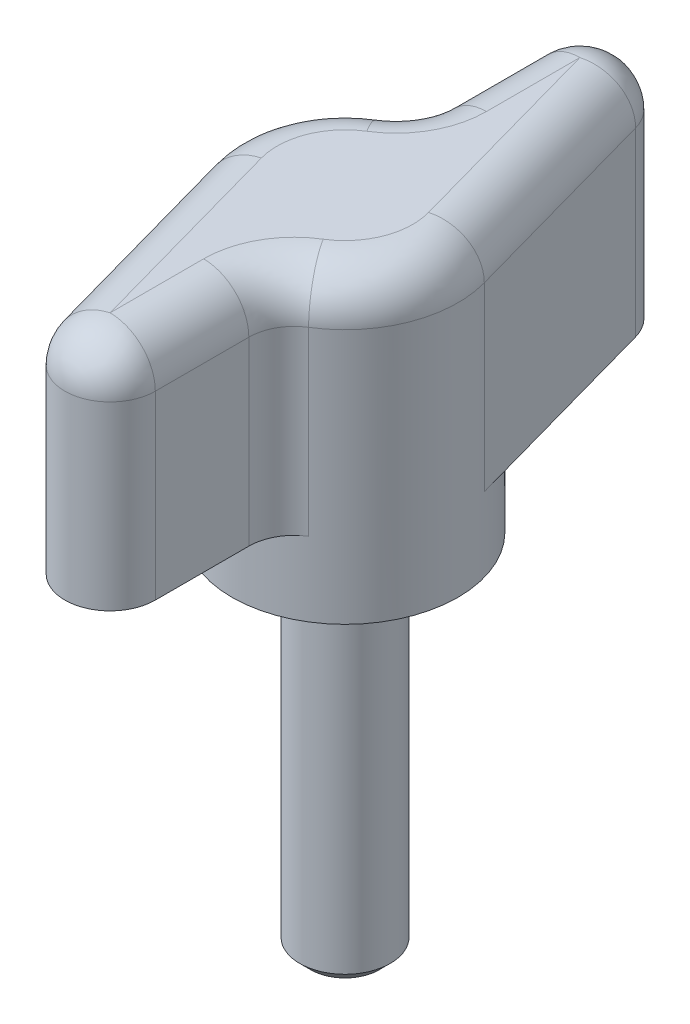
ISO-10303-21;
HEADER;
FILE_DESCRIPTION(('STEP AP214'),'2;1');
FILE_NAME('part.step','',(''),(''),'','','');
FILE_SCHEMA(('AUTOMOTIVE_DESIGN { 1 0 10303 214 1 1 1 1 }'));
ENDSEC;
DATA;
#1=APPLICATION_CONTEXT('core data for automotive mechanical design processes');
#2=APPLICATION_PROTOCOL_DEFINITION('international standard','automotive_design',2000,#1);
#3=PRODUCT_CONTEXT('',#1,'mechanical');
#4=PRODUCT('Part','Part','',(#3));
#5=PRODUCT_RELATED_PRODUCT_CATEGORY('part','',(#4));
#6=PRODUCT_DEFINITION_FORMATION('','',#4);
#7=PRODUCT_DEFINITION_CONTEXT('part definition',#1,'design');
#8=PRODUCT_DEFINITION('design','',#6,#7);
#9=PRODUCT_DEFINITION_SHAPE('','',#8);
#10=(LENGTH_UNIT() NAMED_UNIT(*) SI_UNIT(.MILLI.,.METRE.));
#11=(NAMED_UNIT(*) PLANE_ANGLE_UNIT() SI_UNIT($,.RADIAN.));
#12=(NAMED_UNIT(*) SI_UNIT($,.STERADIAN.) SOLID_ANGLE_UNIT());
#13=UNCERTAINTY_MEASURE_WITH_UNIT(LENGTH_MEASURE(1.E-05),#10,'distance_accuracy_value','');
#14=(GEOMETRIC_REPRESENTATION_CONTEXT(3) GLOBAL_UNCERTAINTY_ASSIGNED_CONTEXT((#13)) GLOBAL_UNIT_ASSIGNED_CONTEXT((#10,
#11,#12)) REPRESENTATION_CONTEXT('',''));
#15=CARTESIAN_POINT('',(0.,0.,0.));
#16=DIRECTION('',(0.,0.,1.));
#17=DIRECTION('',(1.,0.,0.));
#18=AXIS2_PLACEMENT_3D('',#15,#16,#17);
#19=CARTESIAN_POINT('',(0.,-25.4,0.));
#20=DIRECTION('',(0.,1.,0.));
#21=DIRECTION('',(0.,0.,1.));
#22=AXIS2_PLACEMENT_3D('',#19,#20,#21);
#23=CYLINDRICAL_SURFACE('',#22,3.175);
#24=CARTESIAN_POINT('',(0.,-24.638,0.));
#25=DIRECTION('',(0.,-1.,0.));
#26=DIRECTION('',(0.,0.,-1.));
#27=AXIS2_PLACEMENT_3D('',#24,#25,#26);
#28=CIRCLE('',#27,3.175);
#29=CARTESIAN_POINT('',(0.,-24.638,-3.175));
#30=VERTEX_POINT('',#29);
#31=EDGE_CURVE('E11',#30,#30,#28,.F.);
#32=ORIENTED_EDGE('',*,*,#31,.T.);
#33=EDGE_LOOP('',(#32));
#34=FACE_BOUND('',#33,.T.);
#35=CARTESIAN_POINT('',(0.,0.,0.));
#36=DIRECTION('',(0.,-1.,0.));
#37=DIRECTION('',(0.,0.,-1.));
#38=AXIS2_PLACEMENT_3D('',#35,#36,#37);
#39=CIRCLE('',#38,3.175);
#40=CARTESIAN_POINT('',(0.,0.,-3.175));
#41=VERTEX_POINT('',#40);
#42=EDGE_CURVE('E54',#41,#41,#39,.T.);
#43=ORIENTED_EDGE('',*,*,#42,.T.);
#44=EDGE_LOOP('',(#43));
#45=FACE_BOUND('',#44,.T.);
#46=ADVANCED_FACE('F43',(#34,#45),#23,.T.);
#47=CARTESIAN_POINT('',(0.,-25.4,0.));
#48=DIRECTION('',(0.,-1.,0.));
#49=DIRECTION('',(0.,0.,-1.));
#50=AXIS2_PLACEMENT_3D('',#47,#48,#49);
#51=PLANE('',#50);
#52=CARTESIAN_POINT('',(0.,-25.4,0.));
#53=DIRECTION('',(0.,-1.,0.));
#54=DIRECTION('',(0.,0.,-1.));
#55=AXIS2_PLACEMENT_3D('',#52,#53,#54);
#56=CIRCLE('',#55,2.413);
#57=CARTESIAN_POINT('',(0.,-25.4,-2.413));
#58=VERTEX_POINT('',#57);
#59=EDGE_CURVE('E50',#58,#58,#56,.T.);
#60=ORIENTED_EDGE('',*,*,#59,.T.);
#61=EDGE_LOOP('',(#60));
#62=FACE_BOUND('',#61,.T.);
#63=ADVANCED_FACE('F64',(#62),#51,.T.);
#64=CARTESIAN_POINT('',(0.,0.,0.));
#65=DIRECTION('',(0.,-1.,0.));
#66=DIRECTION('',(0.,0.,-1.));
#67=AXIS2_PLACEMENT_3D('',#64,#65,#66);
#68=PLANE('',#67);
#69=ORIENTED_EDGE('',*,*,#42,.F.);
#70=EDGE_LOOP('',(#69));
#71=FACE_BOUND('',#70,.T.);
#72=ADVANCED_FACE('F62',(#71),#68,.F.);
#73=CARTESIAN_POINT('',(0.,-25.4,0.));
#74=DIRECTION('',(0.,1.,0.));
#75=DIRECTION('',(0.,0.,1.));
#76=AXIS2_PLACEMENT_3D('',#73,#74,#75);
#77=CONICAL_SURFACE('',#76,2.413,0.785398163397447);
#78=ORIENTED_EDGE('',*,*,#31,.F.);
#79=EDGE_LOOP('',(#78));
#80=FACE_BOUND('',#79,.T.);
#81=ORIENTED_EDGE('',*,*,#59,.F.);
#82=EDGE_LOOP('',(#81));
#83=FACE_BOUND('',#82,.T.);
#84=ADVANCED_FACE('F45',(#80,#83),#77,.T.);
#85=CLOSED_SHELL('',(#46,#63,#72,#84));
#86=MANIFOLD_SOLID_BREP('B2',#85);
#87=CARTESIAN_POINT('',(0.,21.082,0.));
#88=DIRECTION('',(0.,-1.,0.));
#89=DIRECTION('',(0.,0.,-1.));
#90=AXIS2_PLACEMENT_3D('',#87,#88,#89);
#91=CYLINDRICAL_SURFACE('',#90,7.9375);
#92=CARTESIAN_POINT('',(0.,0.,0.));
#93=DIRECTION('',(0.,1.,0.));
#94=DIRECTION('',(0.,0.,1.));
#95=AXIS2_PLACEMENT_3D('',#92,#93,#94);
#96=CIRCLE('',#95,7.9375);
#97=CARTESIAN_POINT('',(0.,0.,7.9375));
#98=VERTEX_POINT('',#97);
#99=EDGE_CURVE('E247',#98,#98,#96,.T.);
#100=ORIENTED_EDGE('',*,*,#99,.T.);
#101=EDGE_LOOP('',(#100));
#102=FACE_BOUND('',#101,.T.);
#103=DIRECTION('',(0.,1.,0.));
#104=VECTOR('',#103,1.);
#105=CARTESIAN_POINT('',(7.64626830975385,5.207,-2.13037254611816));
#106=LINE('',#105,#104);
#107=CARTESIAN_POINT('',(7.64626830975385,5.207,-2.13037254611816));
#108=VERTEX_POINT('',#107);
#109=CARTESIAN_POINT('',(7.64626830975385,17.907,-2.13037254611816));
#110=VERTEX_POINT('',#109);
#111=EDGE_CURVE('E248',#108,#110,#106,.T.);
#112=ORIENTED_EDGE('',*,*,#111,.T.);
#113=CARTESIAN_POINT('',(0.,17.907,0.));
#114=DIRECTION('',(0.,1.,0.));
#115=DIRECTION('',(0.,0.,1.));
#116=AXIS2_PLACEMENT_3D('',#113,#114,#115);
#117=CIRCLE('',#116,7.9375);
#118=CARTESIAN_POINT('',(4.18894174287397,17.907,6.74215642986782));
#119=VERTEX_POINT('',#118);
#120=EDGE_CURVE('E291',#110,#119,#117,.F.);
#121=ORIENTED_EDGE('',*,*,#120,.T.);
#122=DIRECTION('',(0.,-1.,0.));
#123=VECTOR('',#122,1.);
#124=CARTESIAN_POINT('',(4.18894174287397,21.082,6.74215642986782));
#125=LINE('',#124,#123);
#126=CARTESIAN_POINT('',(4.18894174287397,5.207,6.74215642986782));
#127=VERTEX_POINT('',#126);
#128=EDGE_CURVE('E288',#119,#127,#125,.T.);
#129=ORIENTED_EDGE('',*,*,#128,.T.);
#130=CARTESIAN_POINT('',(0.,5.207,0.));
#131=DIRECTION('',(0.,-1.,0.));
#132=DIRECTION('',(0.,0.,-1.));
#133=AXIS2_PLACEMENT_3D('',#130,#131,#132);
#134=CIRCLE('',#133,7.9375);
#135=CARTESIAN_POINT('',(-7.64626830975387,5.207,2.13037254611811));
#136=VERTEX_POINT('',#135);
#137=EDGE_CURVE('E217',#127,#136,#134,.T.);
#138=ORIENTED_EDGE('',*,*,#137,.T.);
#139=DIRECTION('',(0.,1.,0.));
#140=VECTOR('',#139,1.);
#141=CARTESIAN_POINT('',(-7.64626830975387,5.207,2.13037254611811));
#142=LINE('',#141,#140);
#143=CARTESIAN_POINT('',(-7.64626830975387,17.907,2.13037254611811));
#144=VERTEX_POINT('',#143);
#145=EDGE_CURVE('E207',#136,#144,#142,.T.);
#146=ORIENTED_EDGE('',*,*,#145,.T.);
#147=CARTESIAN_POINT('',(0.,17.907,0.));
#148=DIRECTION('',(0.,1.,0.));
#149=DIRECTION('',(0.,0.,1.));
#150=AXIS2_PLACEMENT_3D('',#147,#148,#149);
#151=CIRCLE('',#150,7.9375);
#152=CARTESIAN_POINT('',(-4.18894174287402,17.907,-6.74215642986779));
#153=VERTEX_POINT('',#152);
#154=EDGE_CURVE('E286',#144,#153,#151,.F.);
#155=ORIENTED_EDGE('',*,*,#154,.T.);
#156=DIRECTION('',(0.,-1.,0.));
#157=VECTOR('',#156,1.);
#158=CARTESIAN_POINT('',(-4.18894174287402,21.082,-6.74215642986779));
#159=LINE('',#158,#157);
#160=CARTESIAN_POINT('',(-4.18894174287402,5.207,-6.74215642986779));
#161=VERTEX_POINT('',#160);
#162=EDGE_CURVE('E283',#153,#161,#159,.T.);
#163=ORIENTED_EDGE('',*,*,#162,.T.);
#164=CARTESIAN_POINT('',(0.,5.207,0.));
#165=DIRECTION('',(0.,-1.,0.));
#166=DIRECTION('',(0.,0.,1.));
#167=AXIS2_PLACEMENT_3D('',#164,#165,#166);
#168=CIRCLE('',#167,7.9375);
#169=EDGE_CURVE('E237',#161,#108,#168,.T.);
#170=ORIENTED_EDGE('',*,*,#169,.T.);
#171=EDGE_LOOP('',(#112,#121,#129,#138,#146,#155,#163,#170));
#172=FACE_BOUND('',#171,.T.);
#173=ADVANCED_FACE('F99',(#102,#172),#91,.T.);
#174=CARTESIAN_POINT('',(0.,21.082,0.));
#175=DIRECTION('',(0.,1.,0.));
#176=DIRECTION('',(0.,0.,1.));
#177=AXIS2_PLACEMENT_3D('',#174,#175,#176);
#178=PLANE('',#177);
#179=CARTESIAN_POINT('',(0.,21.082,0.));
#180=DIRECTION('',(0.,1.,0.));
#181=DIRECTION('',(0.,0.,1.));
#182=AXIS2_PLACEMENT_3D('',#179,#180,#181);
#183=CIRCLE('',#182,4.7625);
#184=CARTESIAN_POINT('',(2.51336504572438,21.082,4.04529385792069));
#185=VERTEX_POINT('',#184);
#186=CARTESIAN_POINT('',(4.58776098585231,21.082,-1.2782235276709));
#187=VERTEX_POINT('',#186);
#188=EDGE_CURVE('E270',#185,#187,#183,.T.);
#189=ORIENTED_EDGE('',*,*,#188,.T.);
#190=DIRECTION('',(-0.268393391636934,0.,-0.963309393354816));
#191=VECTOR('',#190,1.);
#192=CARTESIAN_POINT('',(4.58776098585231,21.082,-1.2782235276709));
#193=LINE('',#192,#191);
#194=CARTESIAN_POINT('',(0.485481559976375,21.082,-16.002));
#195=VERTEX_POINT('',#194);
#196=EDGE_CURVE('E272',#187,#195,#193,.T.);
#197=ORIENTED_EDGE('',*,*,#196,.T.);
#198=DIRECTION('',(0.,0.,1.));
#199=VECTOR('',#198,1.);
#200=CARTESIAN_POINT('',(0.485481559976374,21.082,0.));
#201=LINE('',#200,#199);
#202=CARTESIAN_POINT('',(0.485481559976374,21.082,-9.43901900181491));
#203=VERTEX_POINT('',#202);
#204=EDGE_CURVE('E264',#195,#203,#201,.T.);
#205=ORIENTED_EDGE('',*,*,#204,.T.);
#206=CARTESIAN_POINT('',(-5.86451844002362,21.082,-9.43901900181491));
#207=DIRECTION('',(0.,1.,0.));
#208=DIRECTION('',(0.,0.,1.));
#209=AXIS2_PLACEMENT_3D('',#206,#207,#208);
#210=CIRCLE('',#209,6.35);
#211=CARTESIAN_POINT('',(-2.51336504572441,21.082,-4.04529385792067));
#212=VERTEX_POINT('',#211);
#213=EDGE_CURVE('E261',#212,#203,#210,.T.);
#214=ORIENTED_EDGE('',*,*,#213,.F.);
#215=CARTESIAN_POINT('',(0.,21.082,0.));
#216=DIRECTION('',(0.,1.,0.));
#217=DIRECTION('',(0.,0.,1.));
#218=AXIS2_PLACEMENT_3D('',#215,#216,#217);
#219=CIRCLE('',#218,4.7625);
#220=CARTESIAN_POINT('',(-4.58776098585232,21.082,1.27822352767086));
#221=VERTEX_POINT('',#220);
#222=EDGE_CURVE('E255',#212,#221,#219,.T.);
#223=ORIENTED_EDGE('',*,*,#222,.T.);
#224=DIRECTION('',(0.268393391636927,0.,0.963309393354818));
#225=VECTOR('',#224,1.);
#226=CARTESIAN_POINT('',(-4.58776098585232,21.082,1.27822352767087));
#227=LINE('',#226,#225);
#228=CARTESIAN_POINT('',(-0.485481559976487,21.082,16.002));
#229=VERTEX_POINT('',#228);
#230=EDGE_CURVE('E257',#221,#229,#227,.T.);
#231=ORIENTED_EDGE('',*,*,#230,.T.);
#232=DIRECTION('',(0.,0.,-1.));
#233=VECTOR('',#232,1.);
#234=CARTESIAN_POINT('',(-0.485481559976374,21.082,0.));
#235=LINE('',#234,#233);
#236=CARTESIAN_POINT('',(-0.48548155997644,21.082,9.4390190018149));
#237=VERTEX_POINT('',#236);
#238=EDGE_CURVE('E259',#229,#237,#235,.T.);
#239=ORIENTED_EDGE('',*,*,#238,.T.);
#240=CARTESIAN_POINT('',(5.86451844002356,21.082,9.43901900181495));
#241=DIRECTION('',(0.,1.,0.));
#242=DIRECTION('',(0.,0.,1.));
#243=AXIS2_PLACEMENT_3D('',#240,#241,#242);
#244=CIRCLE('',#243,6.35);
#245=EDGE_CURVE('E267',#185,#237,#244,.T.);
#246=ORIENTED_EDGE('',*,*,#245,.F.);
#247=EDGE_LOOP('',(#189,#197,#205,#214,#223,#231,#239,#246));
#248=FACE_BOUND('',#247,.T.);
#249=ADVANCED_FACE('F350',(#248),#178,.T.);
#250=CARTESIAN_POINT('',(0.,0.,0.));
#251=DIRECTION('',(0.,1.,0.));
#252=DIRECTION('',(0.,0.,1.));
#253=AXIS2_PLACEMENT_3D('',#250,#251,#252);
#254=PLANE('',#253);
#255=ORIENTED_EDGE('',*,*,#99,.F.);
#256=EDGE_LOOP('',(#255));
#257=FACE_BOUND('',#256,.T.);
#258=ADVANCED_FACE('F389',(#257),#254,.F.);
#259=CARTESIAN_POINT('',(0.485481559976374,5.207,-16.002));
#260=DIRECTION('',(0.,1.,0.));
#261=DIRECTION('',(0.,0.,1.));
#262=AXIS2_PLACEMENT_3D('',#259,#260,#261);
#263=CYLINDRICAL_SURFACE('',#262,3.175);
#264=DIRECTION('',(0.,1.,0.));
#265=VECTOR('',#264,1.);
#266=CARTESIAN_POINT('',(-2.68951844002363,5.207,-16.002));
#267=LINE('',#266,#265);
#268=CARTESIAN_POINT('',(-2.68951844002363,5.207,-16.002));
#269=VERTEX_POINT('',#268);
#270=CARTESIAN_POINT('',(-2.68951844002363,17.907,-16.002));
#271=VERTEX_POINT('',#270);
#272=EDGE_CURVE('E243',#269,#271,#267,.T.);
#273=ORIENTED_EDGE('',*,*,#272,.T.);
#274=CARTESIAN_POINT('',(0.485481559976374,17.907,-16.002));
#275=DIRECTION('',(0.,1.,0.));
#276=DIRECTION('',(0.,0.,1.));
#277=AXIS2_PLACEMENT_3D('',#274,#275,#276);
#278=CIRCLE('',#277,3.175);
#279=CARTESIAN_POINT('',(3.54398888387792,17.907,-16.8541490184473));
#280=VERTEX_POINT('',#279);
#281=EDGE_CURVE('E279',#271,#280,#278,.F.);
#282=ORIENTED_EDGE('',*,*,#281,.T.);
#283=DIRECTION('',(0.,1.,0.));
#284=VECTOR('',#283,1.);
#285=CARTESIAN_POINT('',(3.54398888387792,5.207,-16.8541490184473));
#286=LINE('',#285,#284);
#287=CARTESIAN_POINT('',(3.54398888387792,5.207,-16.8541490184473));
#288=VERTEX_POINT('',#287);
#289=EDGE_CURVE('E244',#288,#280,#286,.T.);
#290=ORIENTED_EDGE('',*,*,#289,.F.);
#291=CARTESIAN_POINT('',(0.485481559976374,5.207,-16.002));
#292=DIRECTION('',(0.,1.,0.));
#293=DIRECTION('',(0.,0.,1.));
#294=AXIS2_PLACEMENT_3D('',#291,#292,#293);
#295=CIRCLE('',#294,3.175);
#296=EDGE_CURVE('E229',#288,#269,#295,.T.);
#297=ORIENTED_EDGE('',*,*,#296,.T.);
#298=EDGE_LOOP('',(#273,#282,#290,#297));
#299=FACE_BOUND('',#298,.T.);
#300=ADVANCED_FACE('F378',(#299),#263,.T.);
#301=CARTESIAN_POINT('',(3.54398888387792,5.207,-16.8541490184473));
#302=DIRECTION('',(0.963309393354816,0.,-0.268393391636934));
#303=DIRECTION('',(-0.268393391636934,0.,-0.963309393354816));
#304=AXIS2_PLACEMENT_3D('',#301,#302,#303);
#305=PLANE('',#304);
#306=ORIENTED_EDGE('',*,*,#289,.T.);
#307=DIRECTION('',(-0.268393391636934,0.,-0.963309393354816));
#308=VECTOR('',#307,1.);
#309=CARTESIAN_POINT('',(3.54398888387792,17.907,-16.8541490184473));
#310=LINE('',#309,#308);
#311=EDGE_CURVE('E281',#280,#110,#310,.F.);
#312=ORIENTED_EDGE('',*,*,#311,.T.);
#313=ORIENTED_EDGE('',*,*,#111,.F.);
#314=DIRECTION('',(-0.268393391636934,0.,-0.963309393354816));
#315=VECTOR('',#314,1.);
#316=CARTESIAN_POINT('',(3.54398888387792,5.207,-16.8541490184473));
#317=LINE('',#316,#315);
#318=EDGE_CURVE('E240',#108,#288,#317,.T.);
#319=ORIENTED_EDGE('',*,*,#318,.T.);
#320=EDGE_LOOP('',(#306,#312,#313,#319));
#321=FACE_BOUND('',#320,.T.);
#322=ADVANCED_FACE('F381',(#321),#305,.T.);
#323=CARTESIAN_POINT('',(-2.68951844002363,5.207,-16.002));
#324=DIRECTION('',(-1.,0.,0.));
#325=DIRECTION('',(0.,0.,1.));
#326=AXIS2_PLACEMENT_3D('',#323,#324,#325);
#327=PLANE('',#326);
#328=DIRECTION('',(0.,-1.,0.));
#329=VECTOR('',#328,1.);
#330=CARTESIAN_POINT('',(-2.68951844002363,5.207,-9.43901900181491));
#331=LINE('',#330,#329);
#332=CARTESIAN_POINT('',(-2.68951844002363,5.207,-9.43901900181491));
#333=VERTEX_POINT('',#332);
#334=CARTESIAN_POINT('',(-2.68951844002363,17.907,-9.43901900181491));
#335=VERTEX_POINT('',#334);
#336=EDGE_CURVE('E274',#333,#335,#331,.F.);
#337=ORIENTED_EDGE('',*,*,#336,.T.);
#338=DIRECTION('',(0.,0.,1.));
#339=VECTOR('',#338,1.);
#340=CARTESIAN_POINT('',(-2.68951844002363,17.907,-16.002));
#341=LINE('',#340,#339);
#342=EDGE_CURVE('E276',#335,#271,#341,.F.);
#343=ORIENTED_EDGE('',*,*,#342,.T.);
#344=ORIENTED_EDGE('',*,*,#272,.F.);
#345=DIRECTION('',(0.,0.,1.));
#346=VECTOR('',#345,1.);
#347=CARTESIAN_POINT('',(-2.68951844002363,5.207,-16.002));
#348=LINE('',#347,#346);
#349=EDGE_CURVE('E234',#269,#333,#348,.T.);
#350=ORIENTED_EDGE('',*,*,#349,.T.);
#351=EDGE_LOOP('',(#337,#343,#344,#350));
#352=FACE_BOUND('',#351,.T.);
#353=ADVANCED_FACE('F376',(#352),#327,.T.);
#354=CARTESIAN_POINT('',(0.485481559976374,5.207,-16.002));
#355=DIRECTION('',(0.,1.,0.));
#356=DIRECTION('',(0.,0.,1.));
#357=AXIS2_PLACEMENT_3D('',#354,#355,#356);
#358=PLANE('',#357);
#359=ORIENTED_EDGE('',*,*,#296,.F.);
#360=ORIENTED_EDGE('',*,*,#318,.F.);
#361=ORIENTED_EDGE('',*,*,#169,.F.);
#362=CARTESIAN_POINT('',(-5.86451844002362,5.207,-9.43901900181491));
#363=DIRECTION('',(0.,1.,0.));
#364=DIRECTION('',(0.,0.,1.));
#365=AXIS2_PLACEMENT_3D('',#362,#363,#364);
#366=CIRCLE('',#365,3.175);
#367=EDGE_CURVE('E41',#161,#333,#366,.T.);
#368=ORIENTED_EDGE('',*,*,#367,.T.);
#369=ORIENTED_EDGE('',*,*,#349,.F.);
#370=EDGE_LOOP('',(#359,#360,#361,#368,#369));
#371=FACE_BOUND('',#370,.T.);
#372=ADVANCED_FACE('F373',(#371),#358,.F.);
#373=CARTESIAN_POINT('',(-0.485481559976486,5.207,16.002));
#374=DIRECTION('',(0.,1.,0.));
#375=DIRECTION('',(0.,0.,1.));
#376=AXIS2_PLACEMENT_3D('',#373,#374,#375);
#377=CYLINDRICAL_SURFACE('',#376,3.175);
#378=DIRECTION('',(0.,1.,0.));
#379=VECTOR('',#378,1.);
#380=CARTESIAN_POINT('',(2.68951844002351,5.207,16.002));
#381=LINE('',#380,#379);
#382=CARTESIAN_POINT('',(2.68951844002351,5.207,16.002));
#383=VERTEX_POINT('',#382);
#384=CARTESIAN_POINT('',(2.68951844002351,17.907,16.002));
#385=VERTEX_POINT('',#384);
#386=EDGE_CURVE('E200',#383,#385,#381,.T.);
#387=ORIENTED_EDGE('',*,*,#386,.T.);
#388=CARTESIAN_POINT('',(-0.485481559976486,17.907,16.002));
#389=DIRECTION('',(0.,1.,0.));
#390=DIRECTION('',(0.,0.,1.));
#391=AXIS2_PLACEMENT_3D('',#388,#389,#390);
#392=CIRCLE('',#391,3.175);
#393=CARTESIAN_POINT('',(-3.54398888387803,17.907,16.8541490184472));
#394=VERTEX_POINT('',#393);
#395=EDGE_CURVE('E116',#385,#394,#392,.F.);
#396=ORIENTED_EDGE('',*,*,#395,.T.);
#397=DIRECTION('',(0.,1.,0.));
#398=VECTOR('',#397,1.);
#399=CARTESIAN_POINT('',(-3.54398888387803,5.207,16.8541490184472));
#400=LINE('',#399,#398);
#401=CARTESIAN_POINT('',(-3.54398888387803,5.207,16.8541490184472));
#402=VERTEX_POINT('',#401);
#403=EDGE_CURVE('E220',#402,#394,#400,.T.);
#404=ORIENTED_EDGE('',*,*,#403,.F.);
#405=CARTESIAN_POINT('',(-0.485481559976486,5.207,16.002));
#406=DIRECTION('',(0.,1.,0.));
#407=DIRECTION('',(0.,0.,-1.));
#408=AXIS2_PLACEMENT_3D('',#405,#406,#407);
#409=CIRCLE('',#408,3.175);
#410=EDGE_CURVE('E214',#402,#383,#409,.T.);
#411=ORIENTED_EDGE('',*,*,#410,.T.);
#412=EDGE_LOOP('',(#387,#396,#404,#411));
#413=FACE_BOUND('',#412,.T.);
#414=ADVANCED_FACE('F219',(#413),#377,.T.);
#415=CARTESIAN_POINT('',(-3.54398888387803,5.207,16.8541490184472));
#416=DIRECTION('',(-0.963309393354818,0.,0.268393391636927));
#417=DIRECTION('',(0.268393391636927,0.,0.963309393354818));
#418=AXIS2_PLACEMENT_3D('',#415,#416,#417);
#419=PLANE('',#418);
#420=ORIENTED_EDGE('',*,*,#403,.T.);
#421=DIRECTION('',(0.268393391636927,0.,0.963309393354818));
#422=VECTOR('',#421,1.);
#423=CARTESIAN_POINT('',(-3.54398888387803,17.907,16.8541490184472));
#424=LINE('',#423,#422);
#425=EDGE_CURVE('E296',#394,#144,#424,.F.);
#426=ORIENTED_EDGE('',*,*,#425,.T.);
#427=ORIENTED_EDGE('',*,*,#145,.F.);
#428=DIRECTION('',(0.268393391636927,0.,0.963309393354818));
#429=VECTOR('',#428,1.);
#430=CARTESIAN_POINT('',(-3.54398888387803,5.207,16.8541490184472));
#431=LINE('',#430,#429);
#432=EDGE_CURVE('E208',#136,#402,#431,.T.);
#433=ORIENTED_EDGE('',*,*,#432,.T.);
#434=EDGE_LOOP('',(#420,#426,#427,#433));
#435=FACE_BOUND('',#434,.T.);
#436=ADVANCED_FACE('F439',(#435),#419,.T.);
#437=CARTESIAN_POINT('',(2.68951844002351,5.207,16.002));
#438=DIRECTION('',(1.,0.,0.));
#439=DIRECTION('',(0.,0.,-1.));
#440=AXIS2_PLACEMENT_3D('',#437,#438,#439);
#441=PLANE('',#440);
#442=DIRECTION('',(0.,-1.,0.));
#443=VECTOR('',#442,1.);
#444=CARTESIAN_POINT('',(2.68951844002356,5.207,9.43901900181493));
#445=LINE('',#444,#443);
#446=CARTESIAN_POINT('',(2.68951844002356,5.207,9.43901900181493));
#447=VERTEX_POINT('',#446);
#448=CARTESIAN_POINT('',(2.68951844002356,17.907,9.43901900181493));
#449=VERTEX_POINT('',#448);
#450=EDGE_CURVE('E124',#447,#449,#445,.F.);
#451=ORIENTED_EDGE('',*,*,#450,.T.);
#452=DIRECTION('',(0.,0.,-1.));
#453=VECTOR('',#452,1.);
#454=CARTESIAN_POINT('',(2.68951844002351,17.907,16.002));
#455=LINE('',#454,#453);
#456=EDGE_CURVE('E204',#449,#385,#455,.F.);
#457=ORIENTED_EDGE('',*,*,#456,.T.);
#458=ORIENTED_EDGE('',*,*,#386,.F.);
#459=DIRECTION('',(0.,0.,-1.));
#460=VECTOR('',#459,1.);
#461=CARTESIAN_POINT('',(2.68951844002351,5.207,16.002));
#462=LINE('',#461,#460);
#463=EDGE_CURVE('E203',#383,#447,#462,.T.);
#464=ORIENTED_EDGE('',*,*,#463,.T.);
#465=EDGE_LOOP('',(#451,#457,#458,#464));
#466=FACE_BOUND('',#465,.T.);
#467=ADVANCED_FACE('F202',(#466),#441,.T.);
#468=CARTESIAN_POINT('',(-0.485481559976486,5.207,16.002));
#469=DIRECTION('',(0.,1.,0.));
#470=DIRECTION('',(0.,0.,-1.));
#471=AXIS2_PLACEMENT_3D('',#468,#469,#470);
#472=PLANE('',#471);
#473=ORIENTED_EDGE('',*,*,#410,.F.);
#474=ORIENTED_EDGE('',*,*,#432,.F.);
#475=ORIENTED_EDGE('',*,*,#137,.F.);
#476=CARTESIAN_POINT('',(5.86451844002356,5.207,9.43901900181495));
#477=DIRECTION('',(0.,1.,0.));
#478=DIRECTION('',(0.,0.,1.));
#479=AXIS2_PLACEMENT_3D('',#476,#477,#478);
#480=CIRCLE('',#479,3.175);
#481=EDGE_CURVE('E108',#127,#447,#480,.T.);
#482=ORIENTED_EDGE('',*,*,#481,.T.);
#483=ORIENTED_EDGE('',*,*,#463,.F.);
#484=EDGE_LOOP('',(#473,#474,#475,#482,#483));
#485=FACE_BOUND('',#484,.T.);
#486=ADVANCED_FACE('F212',(#485),#472,.F.);
#487=CARTESIAN_POINT('',(5.86451844002356,21.082,9.43901900181495));
#488=DIRECTION('',(0.,-1.,0.));
#489=DIRECTION('',(0.,0.,-1.));
#490=AXIS2_PLACEMENT_3D('',#487,#488,#489);
#491=CYLINDRICAL_SURFACE('',#490,3.175);
#492=ORIENTED_EDGE('',*,*,#481,.F.);
#493=ORIENTED_EDGE('',*,*,#128,.F.);
#494=CARTESIAN_POINT('',(5.86451844002356,17.907,9.43901900181495));
#495=DIRECTION('',(0.,1.,0.));
#496=DIRECTION('',(0.,0.,1.));
#497=AXIS2_PLACEMENT_3D('',#494,#495,#496);
#498=CIRCLE('',#497,3.175);
#499=EDGE_CURVE('E103',#449,#119,#498,.F.);
#500=ORIENTED_EDGE('',*,*,#499,.F.);
#501=ORIENTED_EDGE('',*,*,#450,.F.);
#502=EDGE_LOOP('',(#492,#493,#500,#501));
#503=FACE_BOUND('',#502,.T.);
#504=ADVANCED_FACE('F101',(#503),#491,.F.);
#505=CARTESIAN_POINT('',(-0.485481559976374,17.907,0.));
#506=DIRECTION('',(0.,0.,-1.));
#507=DIRECTION('',(-1.,0.,0.));
#508=AXIS2_PLACEMENT_3D('',#505,#506,#507);
#509=CYLINDRICAL_SURFACE('',#508,3.175);
#510=CARTESIAN_POINT('',(-0.485481559976486,17.907,16.002));
#511=DIRECTION('',(0.,0.,1.));
#512=DIRECTION('',(1.,0.,0.));
#513=AXIS2_PLACEMENT_3D('',#510,#511,#512);
#514=CIRCLE('',#513,3.175);
#515=EDGE_CURVE('E324',#385,#229,#514,.T.);
#516=ORIENTED_EDGE('',*,*,#515,.F.);
#517=ORIENTED_EDGE('',*,*,#456,.F.);
#518=CARTESIAN_POINT('',(-0.48548155997644,17.907,9.4390190018149));
#519=DIRECTION('',(0.,0.,-1.));
#520=DIRECTION('',(-1.,0.,0.));
#521=AXIS2_PLACEMENT_3D('',#518,#519,#520);
#522=CIRCLE('',#521,3.175);
#523=EDGE_CURVE('E223',#237,#449,#522,.T.);
#524=ORIENTED_EDGE('',*,*,#523,.F.);
#525=ORIENTED_EDGE('',*,*,#238,.F.);
#526=EDGE_LOOP('',(#516,#517,#524,#525));
#527=FACE_BOUND('',#526,.T.);
#528=ADVANCED_FACE('F334',(#527),#509,.T.);
#529=CARTESIAN_POINT('',(5.86451844002356,17.907,9.43901900181495));
#530=DIRECTION('',(0.,1.,0.));
#531=DIRECTION('',(0.,0.,1.));
#532=AXIS2_PLACEMENT_3D('',#529,#530,#531);
#533=TOROIDAL_SURFACE('',#532,6.35,3.175);
#534=ORIENTED_EDGE('',*,*,#523,.T.);
#535=ORIENTED_EDGE('',*,*,#499,.T.);
#536=CARTESIAN_POINT('',(2.51336504572438,17.907,4.04529385792069));
#537=DIRECTION('',(-0.849405534471536,0.,0.527740692015618));
#538=DIRECTION('',(0.527740692015618,0.,0.849405534471536));
#539=AXIS2_PLACEMENT_3D('',#536,#537,#538);
#540=CIRCLE('',#539,3.175);
#541=EDGE_CURVE('E321',#185,#119,#540,.F.);
#542=ORIENTED_EDGE('',*,*,#541,.F.);
#543=ORIENTED_EDGE('',*,*,#245,.T.);
#544=EDGE_LOOP('',(#534,#535,#542,#543));
#545=FACE_BOUND('',#544,.T.);
#546=ADVANCED_FACE('F329',(#545),#533,.T.);
#547=CARTESIAN_POINT('',(-0.485481559976486,17.907,16.002));
#548=DIRECTION('',(0.,0.,1.));
#549=DIRECTION('',(1.,0.,0.));
#550=AXIS2_PLACEMENT_3D('',#547,#548,#549);
#551=SPHERICAL_SURFACE('',#550,3.175);
#552=ORIENTED_EDGE('',*,*,#395,.F.);
#553=ORIENTED_EDGE('',*,*,#515,.T.);
#554=CARTESIAN_POINT('',(-0.485481559976486,17.907,16.002));
#555=DIRECTION('',(-0.268393391636927,0.,-0.963309393354818));
#556=DIRECTION('',(-0.963309393354818,0.,0.268393391636927));
#557=AXIS2_PLACEMENT_3D('',#554,#555,#556);
#558=CIRCLE('',#557,3.175);
#559=EDGE_CURVE('E318',#394,#229,#558,.T.);
#560=ORIENTED_EDGE('',*,*,#559,.F.);
#561=EDGE_LOOP('',(#552,#553,#560));
#562=FACE_BOUND('',#561,.T.);
#563=ADVANCED_FACE('F423',(#562),#551,.T.);
#564=CARTESIAN_POINT('',(0.,17.907,0.));
#565=DIRECTION('',(0.,1.,0.));
#566=DIRECTION('',(0.,0.,1.));
#567=AXIS2_PLACEMENT_3D('',#564,#565,#566);
#568=TOROIDAL_SURFACE('',#567,4.7625,3.175);
#569=ORIENTED_EDGE('',*,*,#541,.T.);
#570=ORIENTED_EDGE('',*,*,#120,.F.);
#571=CARTESIAN_POINT('',(4.58776098585231,17.907,-1.2782235276709));
#572=DIRECTION('',(-0.268393391636934,0.,-0.963309393354816));
#573=DIRECTION('',(-0.963309393354816,0.,0.268393391636934));
#574=AXIS2_PLACEMENT_3D('',#571,#572,#573);
#575=CIRCLE('',#574,3.175);
#576=EDGE_CURVE('E315',#187,#110,#575,.T.);
#577=ORIENTED_EDGE('',*,*,#576,.F.);
#578=ORIENTED_EDGE('',*,*,#188,.F.);
#579=EDGE_LOOP('',(#569,#570,#577,#578));
#580=FACE_BOUND('',#579,.T.);
#581=ADVANCED_FACE('F341',(#580),#568,.T.);
#582=CARTESIAN_POINT('',(-4.58776098585232,17.907,1.27822352767087));
#583=DIRECTION('',(0.268393391636927,0.,0.963309393354818));
#584=DIRECTION('',(0.963309393354818,0.,-0.268393391636927));
#585=AXIS2_PLACEMENT_3D('',#582,#583,#584);
#586=CYLINDRICAL_SURFACE('',#585,3.175);
#587=ORIENTED_EDGE('',*,*,#559,.T.);
#588=ORIENTED_EDGE('',*,*,#230,.F.);
#589=CARTESIAN_POINT('',(-4.58776098585232,17.907,1.27822352767087));
#590=DIRECTION('',(-0.268393391636927,0.,-0.963309393354818));
#591=DIRECTION('',(-0.963309393354818,0.,0.268393391636927));
#592=AXIS2_PLACEMENT_3D('',#589,#590,#591);
#593=CIRCLE('',#592,3.175);
#594=EDGE_CURVE('E312',#144,#221,#593,.T.);
#595=ORIENTED_EDGE('',*,*,#594,.F.);
#596=ORIENTED_EDGE('',*,*,#425,.F.);
#597=EDGE_LOOP('',(#587,#588,#595,#596));
#598=FACE_BOUND('',#597,.T.);
#599=ADVANCED_FACE('F356',(#598),#586,.T.);
#600=CARTESIAN_POINT('',(4.58776098585231,17.907,-1.2782235276709));
#601=DIRECTION('',(-0.268393391636934,0.,-0.963309393354816));
#602=DIRECTION('',(-0.963309393354816,0.,0.268393391636934));
#603=AXIS2_PLACEMENT_3D('',#600,#601,#602);
#604=CYLINDRICAL_SURFACE('',#603,3.175);
#605=ORIENTED_EDGE('',*,*,#576,.T.);
#606=ORIENTED_EDGE('',*,*,#311,.F.);
#607=CARTESIAN_POINT('',(0.485481559976375,17.907,-16.002));
#608=DIRECTION('',(-0.268393391636934,0.,-0.963309393354816));
#609=DIRECTION('',(-0.963309393354816,0.,0.268393391636934));
#610=AXIS2_PLACEMENT_3D('',#607,#608,#609);
#611=CIRCLE('',#610,3.175);
#612=EDGE_CURVE('E309',#195,#280,#611,.T.);
#613=ORIENTED_EDGE('',*,*,#612,.F.);
#614=ORIENTED_EDGE('',*,*,#196,.F.);
#615=EDGE_LOOP('',(#605,#606,#613,#614));
#616=FACE_BOUND('',#615,.T.);
#617=ADVANCED_FACE('F346',(#616),#604,.T.);
#618=CARTESIAN_POINT('',(0.,17.907,0.));
#619=DIRECTION('',(0.,1.,0.));
#620=DIRECTION('',(0.,0.,1.));
#621=AXIS2_PLACEMENT_3D('',#618,#619,#620);
#622=TOROIDAL_SURFACE('',#621,4.7625,3.175);
#623=ORIENTED_EDGE('',*,*,#594,.T.);
#624=ORIENTED_EDGE('',*,*,#222,.F.);
#625=CARTESIAN_POINT('',(-2.51336504572441,17.907,-4.04529385792067));
#626=DIRECTION('',(0.849405534471533,0.,-0.527740692015624));
#627=DIRECTION('',(-0.527740692015624,0.,-0.849405534471533));
#628=AXIS2_PLACEMENT_3D('',#625,#626,#627);
#629=CIRCLE('',#628,3.175);
#630=EDGE_CURVE('E306',#153,#212,#629,.T.);
#631=ORIENTED_EDGE('',*,*,#630,.F.);
#632=ORIENTED_EDGE('',*,*,#154,.F.);
#633=EDGE_LOOP('',(#623,#624,#631,#632));
#634=FACE_BOUND('',#633,.T.);
#635=ADVANCED_FACE('F361',(#634),#622,.T.);
#636=CARTESIAN_POINT('',(-5.86451844002362,21.082,-9.43901900181491));
#637=DIRECTION('',(0.,-1.,0.));
#638=DIRECTION('',(0.,0.,-1.));
#639=AXIS2_PLACEMENT_3D('',#636,#637,#638);
#640=CYLINDRICAL_SURFACE('',#639,3.175);
#641=ORIENTED_EDGE('',*,*,#367,.F.);
#642=ORIENTED_EDGE('',*,*,#162,.F.);
#643=CARTESIAN_POINT('',(-5.86451844002362,17.907,-9.43901900181491));
#644=DIRECTION('',(0.,1.,0.));
#645=DIRECTION('',(0.,0.,1.));
#646=AXIS2_PLACEMENT_3D('',#643,#644,#645);
#647=CIRCLE('',#646,3.175);
#648=EDGE_CURVE('E303',#335,#153,#647,.F.);
#649=ORIENTED_EDGE('',*,*,#648,.F.);
#650=ORIENTED_EDGE('',*,*,#336,.F.);
#651=EDGE_LOOP('',(#641,#642,#649,#650));
#652=FACE_BOUND('',#651,.T.);
#653=ADVANCED_FACE('F367',(#652),#640,.F.);
#654=CARTESIAN_POINT('',(0.485481559976374,17.907,-16.002));
#655=DIRECTION('',(0.,0.,1.));
#656=DIRECTION('',(1.,0.,0.));
#657=AXIS2_PLACEMENT_3D('',#654,#655,#656);
#658=SPHERICAL_SURFACE('',#657,3.175);
#659=ORIENTED_EDGE('',*,*,#612,.T.);
#660=ORIENTED_EDGE('',*,*,#281,.F.);
#661=CARTESIAN_POINT('',(0.485481559976374,17.907,-16.002));
#662=DIRECTION('',(0.,0.,1.));
#663=DIRECTION('',(1.,0.,0.));
#664=AXIS2_PLACEMENT_3D('',#661,#662,#663);
#665=CIRCLE('',#664,3.175);
#666=EDGE_CURVE('E301',#195,#271,#665,.T.);
#667=ORIENTED_EDGE('',*,*,#666,.F.);
#668=EDGE_LOOP('',(#659,#660,#667));
#669=FACE_BOUND('',#668,.T.);
#670=ADVANCED_FACE('F408',(#669),#658,.T.);
#671=CARTESIAN_POINT('',(-5.86451844002362,17.907,-9.43901900181491));
#672=DIRECTION('',(0.,1.,0.));
#673=DIRECTION('',(0.,0.,1.));
#674=AXIS2_PLACEMENT_3D('',#671,#672,#673);
#675=TOROIDAL_SURFACE('',#674,6.35,3.175);
#676=ORIENTED_EDGE('',*,*,#630,.T.);
#677=ORIENTED_EDGE('',*,*,#213,.T.);
#678=CARTESIAN_POINT('',(0.485481559976374,17.907,-9.43901900181491));
#679=DIRECTION('',(0.,0.,1.));
#680=DIRECTION('',(1.,0.,0.));
#681=AXIS2_PLACEMENT_3D('',#678,#679,#680);
#682=CIRCLE('',#681,3.175);
#683=EDGE_CURVE('E299',#335,#203,#682,.F.);
#684=ORIENTED_EDGE('',*,*,#683,.F.);
#685=ORIENTED_EDGE('',*,*,#648,.T.);
#686=EDGE_LOOP('',(#676,#677,#684,#685));
#687=FACE_BOUND('',#686,.T.);
#688=ADVANCED_FACE('F404',(#687),#675,.T.);
#689=CARTESIAN_POINT('',(0.485481559976374,17.907,0.));
#690=DIRECTION('',(0.,0.,1.));
#691=DIRECTION('',(1.,0.,0.));
#692=AXIS2_PLACEMENT_3D('',#689,#690,#691);
#693=CYLINDRICAL_SURFACE('',#692,3.175);
#694=ORIENTED_EDGE('',*,*,#666,.T.);
#695=ORIENTED_EDGE('',*,*,#342,.F.);
#696=ORIENTED_EDGE('',*,*,#683,.T.);
#697=ORIENTED_EDGE('',*,*,#204,.F.);
#698=EDGE_LOOP('',(#694,#695,#696,#697));
#699=FACE_BOUND('',#698,.T.);
#700=ADVANCED_FACE('F401',(#699),#693,.T.);
#701=CLOSED_SHELL('',(#173,#249,#258,#300,#322,#353,#372,#414,#436,#467,#486,#504,#528,#546,
#563,#581,#599,#617,#635,#653,#670,#688,#700));
#702=MANIFOLD_SOLID_BREP('B6',#701);
#703=ADVANCED_BREP_SHAPE_REPRESENTATION('',(#18,#86,#702),#14);
#704=SHAPE_DEFINITION_REPRESENTATION(#9,#703);
ENDSEC;
END-ISO-10303-21;
